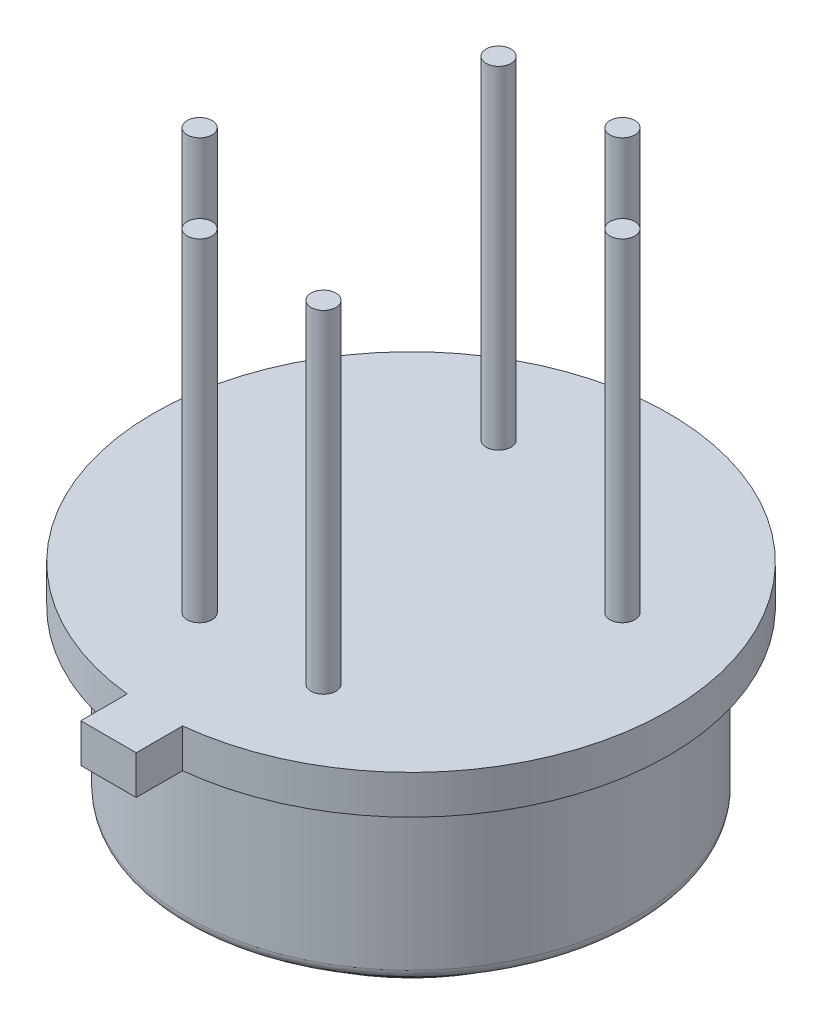
ISO-10303-21;
HEADER;
FILE_DESCRIPTION(('STEP AP214'),'2;1');
FILE_NAME('part.step','',(''),(''),'','','');
FILE_SCHEMA(('AUTOMOTIVE_DESIGN { 1 0 10303 214 1 1 1 1 }'));
ENDSEC;
DATA;
#1=APPLICATION_CONTEXT('core data for automotive mechanical design processes');
#2=APPLICATION_PROTOCOL_DEFINITION('international standard','automotive_design',2000,#1);
#3=PRODUCT_CONTEXT('',#1,'mechanical');
#4=PRODUCT('Part','Part','',(#3));
#5=PRODUCT_RELATED_PRODUCT_CATEGORY('part','',(#4));
#6=PRODUCT_DEFINITION_FORMATION('','',#4);
#7=PRODUCT_DEFINITION_CONTEXT('part definition',#1,'design');
#8=PRODUCT_DEFINITION('design','',#6,#7);
#9=PRODUCT_DEFINITION_SHAPE('','',#8);
#10=(LENGTH_UNIT() NAMED_UNIT(*) SI_UNIT(.MILLI.,.METRE.));
#11=(NAMED_UNIT(*) PLANE_ANGLE_UNIT() SI_UNIT($,.RADIAN.));
#12=(NAMED_UNIT(*) SI_UNIT($,.STERADIAN.) SOLID_ANGLE_UNIT());
#13=UNCERTAINTY_MEASURE_WITH_UNIT(LENGTH_MEASURE(1.E-05),#10,'distance_accuracy_value','');
#14=(GEOMETRIC_REPRESENTATION_CONTEXT(3) GLOBAL_UNCERTAINTY_ASSIGNED_CONTEXT((#13)) GLOBAL_UNIT_ASSIGNED_CONTEXT((#10,
#11,#12)) REPRESENTATION_CONTEXT('',''));
#15=CARTESIAN_POINT('',(0.,0.,0.));
#16=DIRECTION('',(0.,0.,1.));
#17=DIRECTION('',(1.,0.,0.));
#18=AXIS2_PLACEMENT_3D('',#15,#16,#17);
#19=CARTESIAN_POINT('',(22.6831068588196,0.7,14.2285615359797));
#20=DIRECTION('',(0.,-1.,0.));
#21=DIRECTION('',(0.,0.,-1.));
#22=AXIS2_PLACEMENT_3D('',#19,#20,#21);
#23=CYLINDRICAL_SURFACE('',#22,4.65);
#24=CARTESIAN_POINT('',(22.6831068588196,0.,14.2285615359797));
#25=DIRECTION('',(0.,1.,0.));
#26=DIRECTION('',(0.,0.,1.));
#27=AXIS2_PLACEMENT_3D('',#24,#25,#26);
#28=CIRCLE('',#27,4.65);
#29=CARTESIAN_POINT('',(23.1831068588196,0.,18.8516016612652));
#30=VERTEX_POINT('',#29);
#31=CARTESIAN_POINT('',(22.1831068588196,0.,18.8516016612652));
#32=VERTEX_POINT('',#31);
#33=EDGE_CURVE('E113',#30,#32,#28,.T.);
#34=ORIENTED_EDGE('',*,*,#33,.T.);
#35=DIRECTION('',(0.,-1.,0.));
#36=VECTOR('',#35,1.);
#37=CARTESIAN_POINT('',(22.1831068588196,0.7,18.8516016612652));
#38=LINE('',#37,#36);
#39=CARTESIAN_POINT('',(22.1831068588196,0.7,18.8516016612652));
#40=VERTEX_POINT('',#39);
#41=EDGE_CURVE('E50',#32,#40,#38,.F.);
#42=ORIENTED_EDGE('',*,*,#41,.T.);
#43=CARTESIAN_POINT('',(22.6831068588196,0.7,14.2285615359797));
#44=DIRECTION('',(0.,1.,0.));
#45=DIRECTION('',(0.,0.,1.));
#46=AXIS2_PLACEMENT_3D('',#43,#44,#45);
#47=CIRCLE('',#46,4.65);
#48=CARTESIAN_POINT('',(23.1831068588196,0.7,18.8516016612652));
#49=VERTEX_POINT('',#48);
#50=EDGE_CURVE('E54',#49,#40,#47,.T.);
#51=ORIENTED_EDGE('',*,*,#50,.F.);
#52=DIRECTION('',(0.,-1.,0.));
#53=VECTOR('',#52,1.);
#54=CARTESIAN_POINT('',(23.1831068588196,0.7,18.8516016612652));
#55=LINE('',#54,#53);
#56=EDGE_CURVE('E106',#49,#30,#55,.T.);
#57=ORIENTED_EDGE('',*,*,#56,.T.);
#58=EDGE_LOOP('',(#34,#42,#51,#57));
#59=FACE_BOUND('',#58,.T.);
#60=ADVANCED_FACE('F35',(#59),#23,.T.);
#61=CARTESIAN_POINT('',(22.6831068588196,0.7,14.2285615359797));
#62=DIRECTION('',(0.,1.,0.));
#63=DIRECTION('',(0.,0.,1.));
#64=AXIS2_PLACEMENT_3D('',#61,#62,#63);
#65=PLANE('',#64);
#66=CARTESIAN_POINT('',(21.5656712363136,0.7,11.5308333010467));
#67=DIRECTION('',(0.,1.,0.));
#68=DIRECTION('',(0.,0.,1.));
#69=AXIS2_PLACEMENT_3D('',#66,#67,#68);
#70=CIRCLE('',#69,0.225000000000001);
#71=CARTESIAN_POINT('',(21.5656712363136,0.7,11.7558333010467));
#72=VERTEX_POINT('',#71);
#73=EDGE_CURVE('E238',#72,#72,#70,.T.);
#74=ORIENTED_EDGE('',*,*,#73,.F.);
#75=EDGE_LOOP('',(#74));
#76=FACE_BOUND('',#75,.T.);
#77=CARTESIAN_POINT('',(23.8005424813257,0.7,11.5308333010467));
#78=DIRECTION('',(0.,1.,0.));
#79=DIRECTION('',(0.,0.,1.));
#80=AXIS2_PLACEMENT_3D('',#77,#78,#79);
#81=CIRCLE('',#80,0.225000000000001);
#82=CARTESIAN_POINT('',(23.8005424813257,0.7,11.7558333010467));
#83=VERTEX_POINT('',#82);
#84=EDGE_CURVE('E237',#83,#83,#81,.T.);
#85=ORIENTED_EDGE('',*,*,#84,.F.);
#86=EDGE_LOOP('',(#85));
#87=FACE_BOUND('',#86,.T.);
#88=CARTESIAN_POINT('',(25.3808350937526,0.7,13.1111259134736));
#89=DIRECTION('',(0.,1.,0.));
#90=DIRECTION('',(0.,0.,1.));
#91=AXIS2_PLACEMENT_3D('',#88,#89,#90);
#92=CIRCLE('',#91,0.225000000000001);
#93=CARTESIAN_POINT('',(25.3808350937526,0.7,13.3361259134736));
#94=VERTEX_POINT('',#93);
#95=EDGE_CURVE('E247',#94,#94,#92,.T.);
#96=ORIENTED_EDGE('',*,*,#95,.F.);
#97=EDGE_LOOP('',(#96));
#98=FACE_BOUND('',#97,.T.);
#99=CARTESIAN_POINT('',(23.8005424813257,0.7,16.9262897709127));
#100=DIRECTION('',(0.,1.,0.));
#101=DIRECTION('',(0.,0.,1.));
#102=AXIS2_PLACEMENT_3D('',#99,#100,#101);
#103=CIRCLE('',#102,0.225000000000001);
#104=CARTESIAN_POINT('',(23.8005424813257,0.7,17.1512897709127));
#105=VERTEX_POINT('',#104);
#106=EDGE_CURVE('E252',#105,#105,#103,.T.);
#107=ORIENTED_EDGE('',*,*,#106,.F.);
#108=EDGE_LOOP('',(#107));
#109=FACE_BOUND('',#108,.T.);
#110=CARTESIAN_POINT('',(21.5656712363136,0.7,16.9262897709127));
#111=DIRECTION('',(0.,1.,0.));
#112=DIRECTION('',(0.,0.,1.));
#113=AXIS2_PLACEMENT_3D('',#110,#111,#112);
#114=CIRCLE('',#113,0.225000000000001);
#115=CARTESIAN_POINT('',(21.5656712363136,0.7,17.1512897709127));
#116=VERTEX_POINT('',#115);
#117=EDGE_CURVE('E258',#116,#116,#114,.T.);
#118=ORIENTED_EDGE('',*,*,#117,.F.);
#119=EDGE_LOOP('',(#118));
#120=FACE_BOUND('',#119,.T.);
#121=CARTESIAN_POINT('',(19.9853786238867,0.7,15.3459971584858));
#122=DIRECTION('',(0.,1.,0.));
#123=DIRECTION('',(0.,0.,1.));
#124=AXIS2_PLACEMENT_3D('',#121,#122,#123);
#125=CIRCLE('',#124,0.225000000000001);
#126=CARTESIAN_POINT('',(19.9853786238867,0.7,15.5709971584858));
#127=VERTEX_POINT('',#126);
#128=EDGE_CURVE('E264',#127,#127,#125,.T.);
#129=ORIENTED_EDGE('',*,*,#128,.F.);
#130=EDGE_LOOP('',(#129));
#131=FACE_BOUND('',#130,.T.);
#132=ORIENTED_EDGE('',*,*,#50,.T.);
#133=DIRECTION('',(0.,0.,1.));
#134=VECTOR('',#133,1.);
#135=CARTESIAN_POINT('',(22.1831068588196,0.7,18.0618542497226));
#136=LINE('',#135,#134);
#137=CARTESIAN_POINT('',(22.1831068588196,0.7,19.6885615359797));
#138=VERTEX_POINT('',#137);
#139=EDGE_CURVE('E75',#40,#138,#136,.T.);
#140=ORIENTED_EDGE('',*,*,#139,.T.);
#141=DIRECTION('',(1.,0.,0.));
#142=VECTOR('',#141,1.);
#143=CARTESIAN_POINT('',(22.1831068588196,0.7,19.6885615359797));
#144=LINE('',#143,#142);
#145=CARTESIAN_POINT('',(23.1831068588196,0.7,19.6885615359797));
#146=VERTEX_POINT('',#145);
#147=EDGE_CURVE('E80',#138,#146,#144,.T.);
#148=ORIENTED_EDGE('',*,*,#147,.T.);
#149=DIRECTION('',(0.,0.,-1.));
#150=VECTOR('',#149,1.);
#151=CARTESIAN_POINT('',(23.1831068588196,0.7,18.0618542497226));
#152=LINE('',#151,#150);
#153=EDGE_CURVE('E93',#146,#49,#152,.T.);
#154=ORIENTED_EDGE('',*,*,#153,.T.);
#155=EDGE_LOOP('',(#132,#140,#148,#154));
#156=FACE_BOUND('',#155,.T.);
#157=ADVANCED_FACE('F77',(#76,#87,#98,#109,#120,#131,#156),#65,.T.);
#158=CARTESIAN_POINT('',(22.6831068588196,0.,14.2285615359797));
#159=DIRECTION('',(0.,1.,0.));
#160=DIRECTION('',(0.,0.,1.));
#161=AXIS2_PLACEMENT_3D('',#158,#159,#160);
#162=PLANE('',#161);
#163=ORIENTED_EDGE('',*,*,#33,.F.);
#164=DIRECTION('',(0.,0.,1.));
#165=VECTOR('',#164,1.);
#166=CARTESIAN_POINT('',(23.1831068588196,0.,18.0618542497226));
#167=LINE('',#166,#165);
#168=CARTESIAN_POINT('',(23.1831068588196,0.,19.6885615359797));
#169=VERTEX_POINT('',#168);
#170=EDGE_CURVE('E102',#30,#169,#167,.T.);
#171=ORIENTED_EDGE('',*,*,#170,.T.);
#172=DIRECTION('',(-1.,0.,0.));
#173=VECTOR('',#172,1.);
#174=CARTESIAN_POINT('',(22.1831068588196,0.,19.6885615359797));
#175=LINE('',#174,#173);
#176=CARTESIAN_POINT('',(22.1831068588196,0.,19.6885615359797));
#177=VERTEX_POINT('',#176);
#178=EDGE_CURVE('E104',#169,#177,#175,.T.);
#179=ORIENTED_EDGE('',*,*,#178,.T.);
#180=DIRECTION('',(0.,0.,-1.));
#181=VECTOR('',#180,1.);
#182=CARTESIAN_POINT('',(22.1831068588196,0.,18.0618542497226));
#183=LINE('',#182,#181);
#184=EDGE_CURVE('E89',#177,#32,#183,.T.);
#185=ORIENTED_EDGE('',*,*,#184,.T.);
#186=EDGE_LOOP('',(#163,#171,#179,#185));
#187=FACE_BOUND('',#186,.T.);
#188=CARTESIAN_POINT('',(22.6831068588196,0.,14.2285615359797));
#189=DIRECTION('',(0.,-1.,0.));
#190=DIRECTION('',(0.,0.,-1.));
#191=AXIS2_PLACEMENT_3D('',#188,#189,#190);
#192=CIRCLE('',#191,4.075);
#193=CARTESIAN_POINT('',(22.6831068588196,0.,10.1535615359797));
#194=VERTEX_POINT('',#193);
#195=EDGE_CURVE('E120',#194,#194,#192,.T.);
#196=ORIENTED_EDGE('',*,*,#195,.F.);
#197=EDGE_LOOP('',(#196));
#198=FACE_BOUND('',#197,.T.);
#199=ADVANCED_FACE('F152',(#187,#198),#162,.F.);
#200=CARTESIAN_POINT('',(22.6831068588196,-3.,14.2285615359797));
#201=DIRECTION('',(0.,1.,0.));
#202=DIRECTION('',(0.,0.,1.));
#203=AXIS2_PLACEMENT_3D('',#200,#201,#202);
#204=CYLINDRICAL_SURFACE('',#203,4.075);
#205=CARTESIAN_POINT('',(22.6831068588196,-2.8,14.2285615359797));
#206=DIRECTION('',(0.,-1.,0.));
#207=DIRECTION('',(0.,0.,-1.));
#208=AXIS2_PLACEMENT_3D('',#205,#206,#207);
#209=CIRCLE('',#208,4.075);
#210=CARTESIAN_POINT('',(22.6831068588196,-2.8,10.1535615359797));
#211=VERTEX_POINT('',#210);
#212=EDGE_CURVE('E127',#211,#211,#209,.F.);
#213=ORIENTED_EDGE('',*,*,#212,.T.);
#214=EDGE_LOOP('',(#213));
#215=FACE_BOUND('',#214,.T.);
#216=ORIENTED_EDGE('',*,*,#195,.T.);
#217=EDGE_LOOP('',(#216));
#218=FACE_BOUND('',#217,.T.);
#219=ADVANCED_FACE('F157',(#215,#218),#204,.T.);
#220=CARTESIAN_POINT('',(22.6831068588196,-3.,14.2285615359797));
#221=DIRECTION('',(0.,-1.,0.));
#222=DIRECTION('',(0.,0.,-1.));
#223=AXIS2_PLACEMENT_3D('',#220,#221,#222);
#224=PLANE('',#223);
#225=CARTESIAN_POINT('',(22.6831068588196,-3.,14.2285615359797));
#226=DIRECTION('',(0.,-1.,0.));
#227=DIRECTION('',(0.,0.,-1.));
#228=AXIS2_PLACEMENT_3D('',#225,#226,#227);
#229=CIRCLE('',#228,3.875);
#230=CARTESIAN_POINT('',(22.6831068588196,-3.,10.3535615359797));
#231=VERTEX_POINT('',#230);
#232=EDGE_CURVE('E119',#231,#231,#229,.T.);
#233=ORIENTED_EDGE('',*,*,#232,.T.);
#234=EDGE_LOOP('',(#233));
#235=FACE_BOUND('',#234,.T.);
#236=CARTESIAN_POINT('',(22.6831068588196,-3.,14.2285615359797));
#237=DIRECTION('',(0.,-1.,0.));
#238=DIRECTION('',(0.,0.,-1.));
#239=AXIS2_PLACEMENT_3D('',#236,#237,#238);
#240=CIRCLE('',#239,3.25);
#241=CARTESIAN_POINT('',(22.6831068588196,-3.,10.9785615359797));
#242=VERTEX_POINT('',#241);
#243=EDGE_CURVE('E116',#242,#242,#240,.T.);
#244=ORIENTED_EDGE('',*,*,#243,.F.);
#245=EDGE_LOOP('',(#244));
#246=FACE_BOUND('',#245,.T.);
#247=ADVANCED_FACE('F162',(#235,#246),#224,.T.);
#248=CARTESIAN_POINT('',(22.6831068588196,-3.6,14.2285615359797));
#249=DIRECTION('',(0.,1.,0.));
#250=DIRECTION('',(0.,0.,1.));
#251=AXIS2_PLACEMENT_3D('',#248,#249,#250);
#252=CYLINDRICAL_SURFACE('',#251,3.25);
#253=CARTESIAN_POINT('',(22.6831068588196,-3.4,14.2285615359797));
#254=DIRECTION('',(0.,-1.,0.));
#255=DIRECTION('',(0.,0.,-1.));
#256=AXIS2_PLACEMENT_3D('',#253,#254,#255);
#257=CIRCLE('',#256,3.25);
#258=CARTESIAN_POINT('',(22.6831068588196,-3.4,10.9785615359797));
#259=VERTEX_POINT('',#258);
#260=EDGE_CURVE('E11',#259,#259,#257,.F.);
#261=ORIENTED_EDGE('',*,*,#260,.T.);
#262=EDGE_LOOP('',(#261));
#263=FACE_BOUND('',#262,.T.);
#264=ORIENTED_EDGE('',*,*,#243,.T.);
#265=EDGE_LOOP('',(#264));
#266=FACE_BOUND('',#265,.T.);
#267=ADVANCED_FACE('F166',(#263,#266),#252,.T.);
#268=CARTESIAN_POINT('',(22.6831068588196,-3.6,14.2285615359797));
#269=DIRECTION('',(0.,-1.,0.));
#270=DIRECTION('',(0.,0.,-1.));
#271=AXIS2_PLACEMENT_3D('',#268,#269,#270);
#272=PLANE('',#271);
#273=CARTESIAN_POINT('',(22.6831068588196,-3.6,14.2285615359797));
#274=DIRECTION('',(0.,-1.,0.));
#275=DIRECTION('',(0.,0.,-1.));
#276=AXIS2_PLACEMENT_3D('',#273,#274,#275);
#277=CIRCLE('',#276,1.25);
#278=CARTESIAN_POINT('',(22.6831068588196,-3.6,12.9785615359797));
#279=VERTEX_POINT('',#278);
#280=EDGE_CURVE('E109',#279,#279,#277,.T.);
#281=ORIENTED_EDGE('',*,*,#280,.F.);
#282=EDGE_LOOP('',(#281));
#283=FACE_BOUND('',#282,.T.);
#284=CARTESIAN_POINT('',(22.6831068588196,-3.6,14.2285615359797));
#285=DIRECTION('',(0.,-1.,0.));
#286=DIRECTION('',(0.,0.,-1.));
#287=AXIS2_PLACEMENT_3D('',#284,#285,#286);
#288=CIRCLE('',#287,3.05);
#289=CARTESIAN_POINT('',(22.6831068588196,-3.6,11.1785615359797));
#290=VERTEX_POINT('',#289);
#291=EDGE_CURVE('E43',#290,#290,#288,.T.);
#292=ORIENTED_EDGE('',*,*,#291,.T.);
#293=EDGE_LOOP('',(#292));
#294=FACE_BOUND('',#293,.T.);
#295=ADVANCED_FACE('F132',(#283,#294),#272,.T.);
#296=CARTESIAN_POINT('',(22.6831068588196,-2.8,14.2285615359797));
#297=DIRECTION('',(0.,-1.,0.));
#298=DIRECTION('',(0.,0.,-1.));
#299=AXIS2_PLACEMENT_3D('',#296,#297,#298);
#300=TOROIDAL_SURFACE('',#299,3.875,0.2);
#301=ORIENTED_EDGE('',*,*,#212,.F.);
#302=EDGE_LOOP('',(#301));
#303=FACE_BOUND('',#302,.T.);
#304=ORIENTED_EDGE('',*,*,#232,.F.);
#305=EDGE_LOOP('',(#304));
#306=FACE_BOUND('',#305,.T.);
#307=ADVANCED_FACE('F136',(#303,#306),#300,.T.);
#308=CARTESIAN_POINT('',(22.6831068588196,-3.4,14.2285615359797));
#309=DIRECTION('',(0.,-1.,0.));
#310=DIRECTION('',(0.,0.,-1.));
#311=AXIS2_PLACEMENT_3D('',#308,#309,#310);
#312=TOROIDAL_SURFACE('',#311,3.05,0.2);
#313=ORIENTED_EDGE('',*,*,#260,.F.);
#314=EDGE_LOOP('',(#313));
#315=FACE_BOUND('',#314,.T.);
#316=ORIENTED_EDGE('',*,*,#291,.F.);
#317=EDGE_LOOP('',(#316));
#318=FACE_BOUND('',#317,.T.);
#319=ADVANCED_FACE('F37',(#315,#318),#312,.T.);
#320=CARTESIAN_POINT('',(22.6831068588196,-3.2,14.2285615359797));
#321=DIRECTION('',(0.,-1.,0.));
#322=DIRECTION('',(0.,0.,-1.));
#323=AXIS2_PLACEMENT_3D('',#320,#321,#322);
#324=CYLINDRICAL_SURFACE('',#323,1.25);
#325=CARTESIAN_POINT('',(22.6831068588196,-3.2,14.2285615359797));
#326=DIRECTION('',(0.,-1.,0.));
#327=DIRECTION('',(0.,0.,-1.));
#328=AXIS2_PLACEMENT_3D('',#325,#326,#327);
#329=CIRCLE('',#328,1.25);
#330=CARTESIAN_POINT('',(22.6831068588196,-3.2,12.9785615359797));
#331=VERTEX_POINT('',#330);
#332=EDGE_CURVE('E110',#331,#331,#329,.T.);
#333=ORIENTED_EDGE('',*,*,#332,.F.);
#334=EDGE_LOOP('',(#333));
#335=FACE_BOUND('',#334,.T.);
#336=ORIENTED_EDGE('',*,*,#280,.T.);
#337=EDGE_LOOP('',(#336));
#338=FACE_BOUND('',#337,.T.);
#339=ADVANCED_FACE('F135',(#335,#338),#324,.F.);
#340=CARTESIAN_POINT('',(22.6831068588196,-3.2,14.2285615359797));
#341=DIRECTION('',(0.,-1.,0.));
#342=DIRECTION('',(0.,0.,-1.));
#343=AXIS2_PLACEMENT_3D('',#340,#341,#342);
#344=PLANE('',#343);
#345=ORIENTED_EDGE('',*,*,#332,.T.);
#346=EDGE_LOOP('',(#345));
#347=FACE_BOUND('',#346,.T.);
#348=ADVANCED_FACE('F142',(#347),#344,.T.);
#349=CARTESIAN_POINT('',(22.1831068588196,-1.90949642449569,18.0618542497226));
#350=DIRECTION('',(-1.,0.,0.));
#351=DIRECTION('',(0.,0.,1.));
#352=AXIS2_PLACEMENT_3D('',#349,#350,#351);
#353=PLANE('',#352);
#354=ORIENTED_EDGE('',*,*,#41,.F.);
#355=ORIENTED_EDGE('',*,*,#184,.F.);
#356=DIRECTION('',(0.,1.,0.));
#357=VECTOR('',#356,1.);
#358=CARTESIAN_POINT('',(22.1831068588196,-1.90949642449569,19.6885615359797));
#359=LINE('',#358,#357);
#360=EDGE_CURVE('E86',#177,#138,#359,.T.);
#361=ORIENTED_EDGE('',*,*,#360,.T.);
#362=ORIENTED_EDGE('',*,*,#139,.F.);
#363=EDGE_LOOP('',(#354,#355,#361,#362));
#364=FACE_BOUND('',#363,.T.);
#365=ADVANCED_FACE('F87',(#364),#353,.T.);
#366=CARTESIAN_POINT('',(23.1831068588196,-1.90949642449569,18.0618542497226));
#367=DIRECTION('',(1.,0.,0.));
#368=DIRECTION('',(0.,0.,-1.));
#369=AXIS2_PLACEMENT_3D('',#366,#367,#368);
#370=PLANE('',#369);
#371=ORIENTED_EDGE('',*,*,#56,.F.);
#372=ORIENTED_EDGE('',*,*,#153,.F.);
#373=DIRECTION('',(0.,1.,0.));
#374=VECTOR('',#373,1.);
#375=CARTESIAN_POINT('',(23.1831068588196,-1.90949642449569,19.6885615359797));
#376=LINE('',#375,#374);
#377=EDGE_CURVE('E92',#169,#146,#376,.T.);
#378=ORIENTED_EDGE('',*,*,#377,.F.);
#379=ORIENTED_EDGE('',*,*,#170,.F.);
#380=EDGE_LOOP('',(#371,#372,#378,#379));
#381=FACE_BOUND('',#380,.T.);
#382=ADVANCED_FACE('F179',(#381),#370,.T.);
#383=CARTESIAN_POINT('',(22.1831068588196,-1.90949642449569,19.6885615359797));
#384=DIRECTION('',(0.,0.,1.));
#385=DIRECTION('',(1.,0.,0.));
#386=AXIS2_PLACEMENT_3D('',#383,#384,#385);
#387=PLANE('',#386);
#388=ORIENTED_EDGE('',*,*,#178,.F.);
#389=ORIENTED_EDGE('',*,*,#377,.T.);
#390=ORIENTED_EDGE('',*,*,#147,.F.);
#391=ORIENTED_EDGE('',*,*,#360,.F.);
#392=EDGE_LOOP('',(#388,#389,#390,#391));
#393=FACE_BOUND('',#392,.T.);
#394=ADVANCED_FACE('F95',(#393),#387,.T.);
#395=CARTESIAN_POINT('',(19.9853786238867,6.7,15.3459971584858));
#396=DIRECTION('',(0.,-1.,0.));
#397=DIRECTION('',(0.,0.,-1.));
#398=AXIS2_PLACEMENT_3D('',#395,#396,#397);
#399=CYLINDRICAL_SURFACE('',#398,0.225000000000001);
#400=CARTESIAN_POINT('',(19.9853786238867,6.7,15.3459971584858));
#401=DIRECTION('',(0.,1.,0.));
#402=DIRECTION('',(0.,0.,1.));
#403=AXIS2_PLACEMENT_3D('',#400,#401,#402);
#404=CIRCLE('',#403,0.225000000000001);
#405=CARTESIAN_POINT('',(19.9853786238867,6.7,15.5709971584858));
#406=VERTEX_POINT('',#405);
#407=EDGE_CURVE('E82',#406,#406,#404,.T.);
#408=ORIENTED_EDGE('',*,*,#407,.F.);
#409=EDGE_LOOP('',(#408));
#410=FACE_BOUND('',#409,.T.);
#411=ORIENTED_EDGE('',*,*,#128,.T.);
#412=EDGE_LOOP('',(#411));
#413=FACE_BOUND('',#412,.T.);
#414=ADVANCED_FACE('F182',(#410,#413),#399,.T.);
#415=CARTESIAN_POINT('',(19.9853786238867,6.7,15.3459971584858));
#416=DIRECTION('',(0.,1.,0.));
#417=DIRECTION('',(0.,0.,1.));
#418=AXIS2_PLACEMENT_3D('',#415,#416,#417);
#419=PLANE('',#418);
#420=ORIENTED_EDGE('',*,*,#407,.T.);
#421=EDGE_LOOP('',(#420));
#422=FACE_BOUND('',#421,.T.);
#423=ADVANCED_FACE('F188',(#422),#419,.T.);
#424=CARTESIAN_POINT('',(21.5656712363136,6.7,16.9262897709127));
#425=DIRECTION('',(0.,-1.,0.));
#426=DIRECTION('',(0.,0.,-1.));
#427=AXIS2_PLACEMENT_3D('',#424,#425,#426);
#428=CYLINDRICAL_SURFACE('',#427,0.225000000000001);
#429=CARTESIAN_POINT('',(21.5656712363136,6.7,16.9262897709127));
#430=DIRECTION('',(0.,1.,0.));
#431=DIRECTION('',(0.,0.,1.));
#432=AXIS2_PLACEMENT_3D('',#429,#430,#431);
#433=CIRCLE('',#432,0.225000000000001);
#434=CARTESIAN_POINT('',(21.5656712363136,6.7,17.1512897709127));
#435=VERTEX_POINT('',#434);
#436=EDGE_CURVE('E261',#435,#435,#433,.T.);
#437=ORIENTED_EDGE('',*,*,#436,.F.);
#438=EDGE_LOOP('',(#437));
#439=FACE_BOUND('',#438,.T.);
#440=ORIENTED_EDGE('',*,*,#117,.T.);
#441=EDGE_LOOP('',(#440));
#442=FACE_BOUND('',#441,.T.);
#443=ADVANCED_FACE('F192',(#439,#442),#428,.T.);
#444=CARTESIAN_POINT('',(21.5656712363136,6.7,16.9262897709127));
#445=DIRECTION('',(0.,1.,0.));
#446=DIRECTION('',(0.,0.,1.));
#447=AXIS2_PLACEMENT_3D('',#444,#445,#446);
#448=PLANE('',#447);
#449=ORIENTED_EDGE('',*,*,#436,.T.);
#450=EDGE_LOOP('',(#449));
#451=FACE_BOUND('',#450,.T.);
#452=ADVANCED_FACE('F196',(#451),#448,.T.);
#453=CARTESIAN_POINT('',(23.8005424813257,6.7,16.9262897709127));
#454=DIRECTION('',(0.,-1.,0.));
#455=DIRECTION('',(0.,0.,-1.));
#456=AXIS2_PLACEMENT_3D('',#453,#454,#455);
#457=CYLINDRICAL_SURFACE('',#456,0.225000000000001);
#458=CARTESIAN_POINT('',(23.8005424813257,6.7,16.9262897709127));
#459=DIRECTION('',(0.,1.,0.));
#460=DIRECTION('',(0.,0.,1.));
#461=AXIS2_PLACEMENT_3D('',#458,#459,#460);
#462=CIRCLE('',#461,0.225000000000001);
#463=CARTESIAN_POINT('',(23.8005424813257,6.7,17.1512897709127));
#464=VERTEX_POINT('',#463);
#465=EDGE_CURVE('E255',#464,#464,#462,.T.);
#466=ORIENTED_EDGE('',*,*,#465,.F.);
#467=EDGE_LOOP('',(#466));
#468=FACE_BOUND('',#467,.T.);
#469=ORIENTED_EDGE('',*,*,#106,.T.);
#470=EDGE_LOOP('',(#469));
#471=FACE_BOUND('',#470,.T.);
#472=ADVANCED_FACE('F200',(#468,#471),#457,.T.);
#473=CARTESIAN_POINT('',(23.8005424813257,6.7,16.9262897709127));
#474=DIRECTION('',(0.,1.,0.));
#475=DIRECTION('',(0.,0.,1.));
#476=AXIS2_PLACEMENT_3D('',#473,#474,#475);
#477=PLANE('',#476);
#478=ORIENTED_EDGE('',*,*,#465,.T.);
#479=EDGE_LOOP('',(#478));
#480=FACE_BOUND('',#479,.T.);
#481=ADVANCED_FACE('F204',(#480),#477,.T.);
#482=CARTESIAN_POINT('',(25.3808350937526,6.7,13.1111259134736));
#483=DIRECTION('',(0.,-1.,0.));
#484=DIRECTION('',(0.,0.,-1.));
#485=AXIS2_PLACEMENT_3D('',#482,#483,#484);
#486=CYLINDRICAL_SURFACE('',#485,0.225000000000001);
#487=CARTESIAN_POINT('',(25.3808350937526,6.7,13.1111259134736));
#488=DIRECTION('',(0.,1.,0.));
#489=DIRECTION('',(0.,0.,1.));
#490=AXIS2_PLACEMENT_3D('',#487,#488,#489);
#491=CIRCLE('',#490,0.225000000000001);
#492=CARTESIAN_POINT('',(25.3808350937526,6.7,13.3361259134736));
#493=VERTEX_POINT('',#492);
#494=EDGE_CURVE('E249',#493,#493,#491,.T.);
#495=ORIENTED_EDGE('',*,*,#494,.F.);
#496=EDGE_LOOP('',(#495));
#497=FACE_BOUND('',#496,.T.);
#498=ORIENTED_EDGE('',*,*,#95,.T.);
#499=EDGE_LOOP('',(#498));
#500=FACE_BOUND('',#499,.T.);
#501=ADVANCED_FACE('F208',(#497,#500),#486,.T.);
#502=CARTESIAN_POINT('',(25.3808350937526,6.7,13.1111259134736));
#503=DIRECTION('',(0.,1.,0.));
#504=DIRECTION('',(0.,0.,1.));
#505=AXIS2_PLACEMENT_3D('',#502,#503,#504);
#506=PLANE('',#505);
#507=ORIENTED_EDGE('',*,*,#494,.T.);
#508=EDGE_LOOP('',(#507));
#509=FACE_BOUND('',#508,.T.);
#510=ADVANCED_FACE('F212',(#509),#506,.T.);
#511=CARTESIAN_POINT('',(23.8005424813257,6.7,11.5308333010467));
#512=DIRECTION('',(0.,-1.,0.));
#513=DIRECTION('',(0.,0.,-1.));
#514=AXIS2_PLACEMENT_3D('',#511,#512,#513);
#515=CYLINDRICAL_SURFACE('',#514,0.225000000000001);
#516=CARTESIAN_POINT('',(23.8005424813257,6.7,11.5308333010467));
#517=DIRECTION('',(0.,1.,0.));
#518=DIRECTION('',(0.,0.,1.));
#519=AXIS2_PLACEMENT_3D('',#516,#517,#518);
#520=CIRCLE('',#519,0.225000000000001);
#521=CARTESIAN_POINT('',(23.8005424813257,6.7,11.7558333010467));
#522=VERTEX_POINT('',#521);
#523=EDGE_CURVE('E241',#522,#522,#520,.T.);
#524=ORIENTED_EDGE('',*,*,#523,.F.);
#525=EDGE_LOOP('',(#524));
#526=FACE_BOUND('',#525,.T.);
#527=ORIENTED_EDGE('',*,*,#84,.T.);
#528=EDGE_LOOP('',(#527));
#529=FACE_BOUND('',#528,.T.);
#530=ADVANCED_FACE('F216',(#526,#529),#515,.T.);
#531=CARTESIAN_POINT('',(23.8005424813257,6.7,11.5308333010467));
#532=DIRECTION('',(0.,1.,0.));
#533=DIRECTION('',(0.,0.,1.));
#534=AXIS2_PLACEMENT_3D('',#531,#532,#533);
#535=PLANE('',#534);
#536=ORIENTED_EDGE('',*,*,#523,.T.);
#537=EDGE_LOOP('',(#536));
#538=FACE_BOUND('',#537,.T.);
#539=ADVANCED_FACE('F220',(#538),#535,.T.);
#540=CARTESIAN_POINT('',(21.5656712363136,6.7,11.5308333010467));
#541=DIRECTION('',(0.,-1.,0.));
#542=DIRECTION('',(0.,0.,-1.));
#543=AXIS2_PLACEMENT_3D('',#540,#541,#542);
#544=CYLINDRICAL_SURFACE('',#543,0.225000000000001);
#545=CARTESIAN_POINT('',(21.5656712363136,6.7,11.5308333010467));
#546=DIRECTION('',(0.,1.,0.));
#547=DIRECTION('',(0.,0.,1.));
#548=AXIS2_PLACEMENT_3D('',#545,#546,#547);
#549=CIRCLE('',#548,0.225000000000001);
#550=CARTESIAN_POINT('',(21.5656712363136,6.7,11.7558333010467));
#551=VERTEX_POINT('',#550);
#552=EDGE_CURVE('E236',#551,#551,#549,.T.);
#553=ORIENTED_EDGE('',*,*,#552,.F.);
#554=EDGE_LOOP('',(#553));
#555=FACE_BOUND('',#554,.T.);
#556=ORIENTED_EDGE('',*,*,#73,.T.);
#557=EDGE_LOOP('',(#556));
#558=FACE_BOUND('',#557,.T.);
#559=ADVANCED_FACE('F224',(#555,#558),#544,.T.);
#560=CARTESIAN_POINT('',(21.5656712363136,6.7,11.5308333010467));
#561=DIRECTION('',(0.,1.,0.));
#562=DIRECTION('',(0.,0.,1.));
#563=AXIS2_PLACEMENT_3D('',#560,#561,#562);
#564=PLANE('',#563);
#565=ORIENTED_EDGE('',*,*,#552,.T.);
#566=EDGE_LOOP('',(#565));
#567=FACE_BOUND('',#566,.T.);
#568=ADVANCED_FACE('F228',(#567),#564,.T.);
#569=CLOSED_SHELL('',(#60,#157,#199,#219,#247,#267,#295,#307,#319,#339,#348,#365,#382,#394,#414,
#423,#443,#452,#472,#481,#501,#510,#530,#539,#559,#568));
#570=MANIFOLD_SOLID_BREP('B2',#569);
#571=ADVANCED_BREP_SHAPE_REPRESENTATION('',(#18,#570),#14);
#572=SHAPE_DEFINITION_REPRESENTATION(#9,#571);
ENDSEC;
END-ISO-10303-21;
